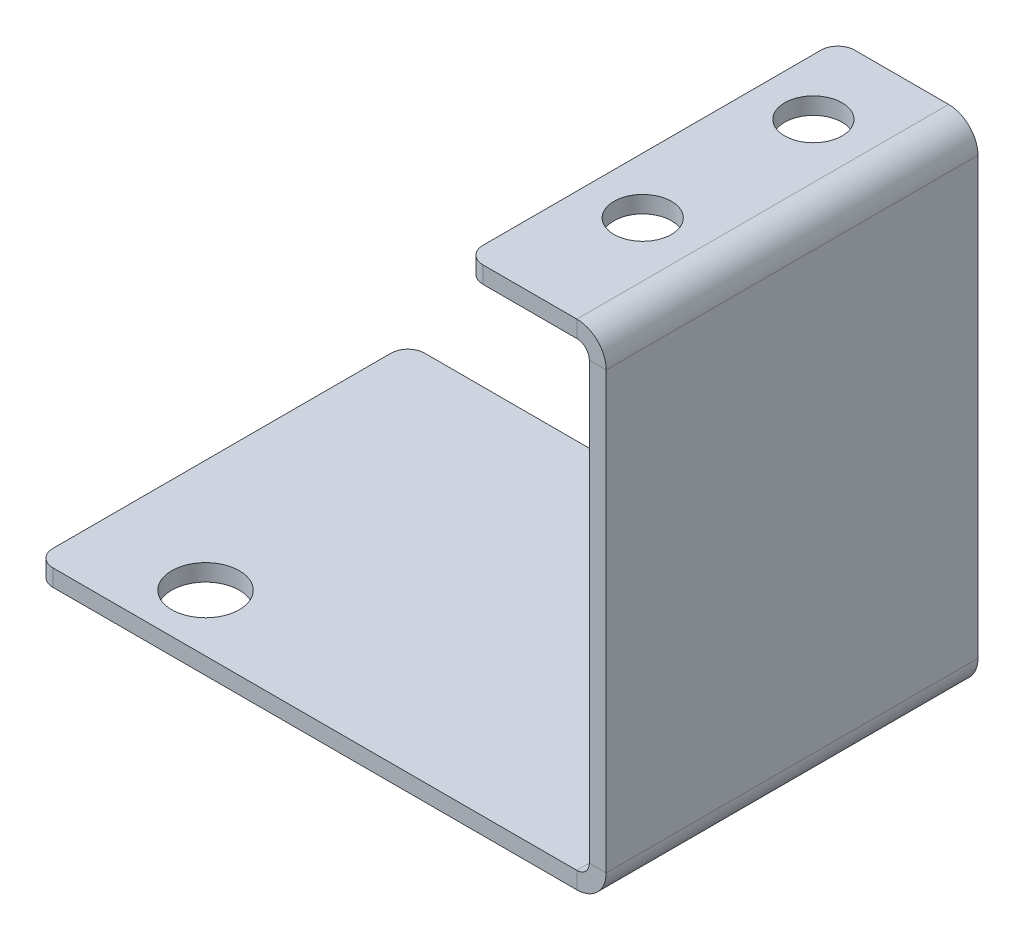
ISO-10303-21;
HEADER;
FILE_DESCRIPTION(('STEP AP214'),'2;1');
FILE_NAME('part.step','',(''),(''),'','','');
FILE_SCHEMA(('AUTOMOTIVE_DESIGN { 1 0 10303 214 1 1 1 1 }'));
ENDSEC;
DATA;
#1=APPLICATION_CONTEXT('core data for automotive mechanical design processes');
#2=APPLICATION_PROTOCOL_DEFINITION('international standard','automotive_design',2000,#1);
#3=PRODUCT_CONTEXT('',#1,'mechanical');
#4=PRODUCT('Part','Part','',(#3));
#5=PRODUCT_RELATED_PRODUCT_CATEGORY('part','',(#4));
#6=PRODUCT_DEFINITION_FORMATION('','',#4);
#7=PRODUCT_DEFINITION_CONTEXT('part definition',#1,'design');
#8=PRODUCT_DEFINITION('design','',#6,#7);
#9=PRODUCT_DEFINITION_SHAPE('','',#8);
#10=(LENGTH_UNIT() NAMED_UNIT(*) SI_UNIT(.MILLI.,.METRE.));
#11=(NAMED_UNIT(*) PLANE_ANGLE_UNIT() SI_UNIT($,.RADIAN.));
#12=(NAMED_UNIT(*) SI_UNIT($,.STERADIAN.) SOLID_ANGLE_UNIT());
#13=UNCERTAINTY_MEASURE_WITH_UNIT(LENGTH_MEASURE(1.E-05),#10,'distance_accuracy_value','');
#14=(GEOMETRIC_REPRESENTATION_CONTEXT(3) GLOBAL_UNCERTAINTY_ASSIGNED_CONTEXT((#13)) GLOBAL_UNIT_ASSIGNED_CONTEXT((#10,
#11,#12)) REPRESENTATION_CONTEXT('',''));
#15=CARTESIAN_POINT('',(0.,0.,0.));
#16=DIRECTION('',(0.,0.,1.));
#17=DIRECTION('',(1.,0.,0.));
#18=AXIS2_PLACEMENT_3D('',#15,#16,#17);
#19=CARTESIAN_POINT('',(-53.575192275457,54.1059455377422,0.));
#20=DIRECTION('',(1.,0.,0.));
#21=DIRECTION('',(0.,0.,-1.));
#22=AXIS2_PLACEMENT_3D('',#19,#20,#21);
#23=PLANE('',#22);
#24=DIRECTION('',(0.,-1.,0.));
#25=VECTOR('',#24,1.);
#26=CARTESIAN_POINT('',(-53.5751922754567,-33.2058467377146,-15.6679136445221));
#27=LINE('',#26,#25);
#28=CARTESIAN_POINT('',(-53.5751922754569,26.5141532622854,-15.6679136445221));
#29=VERTEX_POINT('',#28);
#30=CARTESIAN_POINT('',(-53.5751922754568,0.736600000000004,-15.6679136445221));
#31=VERTEX_POINT('',#30);
#32=EDGE_CURVE('E301',#29,#31,#27,.T.);
#33=ORIENTED_EDGE('',*,*,#32,.F.);
#34=DIRECTION('',(0.,0.,1.));
#35=VECTOR('',#34,1.);
#36=CARTESIAN_POINT('',(-53.5751922754569,26.5141532622854,0.));
#37=LINE('',#36,#35);
#38=CARTESIAN_POINT('',(-53.5751922754569,26.5141532622854,6.33208635547784));
#39=VERTEX_POINT('',#38);
#40=EDGE_CURVE('E309',#29,#39,#37,.T.);
#41=ORIENTED_EDGE('',*,*,#40,.T.);
#42=DIRECTION('',(0.,1.,0.));
#43=VECTOR('',#42,1.);
#44=CARTESIAN_POINT('',(-53.5751922754569,35.0141532622854,6.33208635547784));
#45=LINE('',#44,#43);
#46=CARTESIAN_POINT('',(-53.5751922754568,0.736600000000002,6.33208635547784));
#47=VERTEX_POINT('',#46);
#48=EDGE_CURVE('E316',#47,#39,#45,.T.);
#49=ORIENTED_EDGE('',*,*,#48,.F.);
#50=DIRECTION('',(0.,0.,1.));
#51=VECTOR('',#50,1.);
#52=CARTESIAN_POINT('',(-53.5751922754568,0.736600000000004,0.));
#53=LINE('',#52,#51);
#54=EDGE_CURVE('E297',#31,#47,#53,.T.);
#55=ORIENTED_EDGE('',*,*,#54,.F.);
#56=EDGE_LOOP('',(#33,#41,#49,#55));
#57=FACE_BOUND('',#56,.T.);
#58=ADVANCED_FACE('F51',(#57),#23,.T.);
#59=CARTESIAN_POINT('',(-53.5751922754569,35.0141532622854,6.33208635547784));
#60=DIRECTION('',(0.,0.,1.));
#61=DIRECTION('',(0.,1.,0.));
#62=AXIS2_PLACEMENT_3D('',#59,#60,#61);
#63=PLANE('',#62);
#64=ORIENTED_EDGE('',*,*,#48,.T.);
#65=DIRECTION('',(-1.,0.,0.));
#66=VECTOR('',#65,1.);
#67=CARTESIAN_POINT('',(-53.5751922754569,26.5141532622854,6.33208635547784));
#68=LINE('',#67,#66);
#69=CARTESIAN_POINT('',(-54.5751922754569,26.5141532622854,6.33208635547784));
#70=VERTEX_POINT('',#69);
#71=EDGE_CURVE('E12',#39,#70,#68,.T.);
#72=ORIENTED_EDGE('',*,*,#71,.T.);
#73=DIRECTION('',(0.,1.,0.));
#74=VECTOR('',#73,1.);
#75=CARTESIAN_POINT('',(-54.5751922754569,35.0141532622854,6.33208635547784));
#76=LINE('',#75,#74);
#77=CARTESIAN_POINT('',(-54.5751922754568,0.736599999999997,6.33208635547784));
#78=VERTEX_POINT('',#77);
#79=EDGE_CURVE('E254',#78,#70,#76,.T.);
#80=ORIENTED_EDGE('',*,*,#79,.F.);
#81=DIRECTION('',(-1.,0.,0.));
#82=VECTOR('',#81,1.);
#83=CARTESIAN_POINT('',(-53.5751922754568,0.736600000000004,6.33208635547784));
#84=LINE('',#83,#82);
#85=EDGE_CURVE('E300',#47,#78,#84,.T.);
#86=ORIENTED_EDGE('',*,*,#85,.F.);
#87=EDGE_LOOP('',(#64,#72,#80,#86));
#88=FACE_BOUND('',#87,.T.);
#89=ADVANCED_FACE('F53',(#88),#63,.T.);
#90=CARTESIAN_POINT('',(-53.5751922754567,-33.2058467377146,-15.6679136445221));
#91=DIRECTION('',(0.,0.,-1.));
#92=DIRECTION('',(0.,-1.,0.));
#93=AXIS2_PLACEMENT_3D('',#90,#91,#92);
#94=PLANE('',#93);
#95=DIRECTION('',(0.,-1.,0.));
#96=VECTOR('',#95,1.);
#97=CARTESIAN_POINT('',(-54.5751922754567,-33.2058467377146,-15.6679136445221));
#98=LINE('',#97,#96);
#99=CARTESIAN_POINT('',(-54.5751922754569,26.5141532622854,-15.6679136445221));
#100=VERTEX_POINT('',#99);
#101=CARTESIAN_POINT('',(-54.5751922754568,0.736599999999997,-15.6679136445221));
#102=VERTEX_POINT('',#101);
#103=EDGE_CURVE('E74',#100,#102,#98,.T.);
#104=ORIENTED_EDGE('',*,*,#103,.F.);
#105=DIRECTION('',(1.,0.,0.));
#106=VECTOR('',#105,1.);
#107=CARTESIAN_POINT('',(-53.5751922754569,26.5141532622854,-15.6679136445221));
#108=LINE('',#107,#106);
#109=EDGE_CURVE('E312',#100,#29,#108,.T.);
#110=ORIENTED_EDGE('',*,*,#109,.T.);
#111=ORIENTED_EDGE('',*,*,#32,.T.);
#112=DIRECTION('',(1.,0.,0.));
#113=VECTOR('',#112,1.);
#114=CARTESIAN_POINT('',(-53.5751922754568,0.736600000000004,-15.6679136445221));
#115=LINE('',#114,#113);
#116=EDGE_CURVE('E306',#102,#31,#115,.T.);
#117=ORIENTED_EDGE('',*,*,#116,.F.);
#118=EDGE_LOOP('',(#104,#110,#111,#117));
#119=FACE_BOUND('',#118,.T.);
#120=ADVANCED_FACE('F363',(#119),#94,.T.);
#121=CARTESIAN_POINT('',(-54.575192275457,54.1059455377422,0.));
#122=DIRECTION('',(1.,0.,0.));
#123=DIRECTION('',(0.,0.,-1.));
#124=AXIS2_PLACEMENT_3D('',#121,#122,#123);
#125=PLANE('',#124);
#126=DIRECTION('',(0.,0.,1.));
#127=VECTOR('',#126,1.);
#128=CARTESIAN_POINT('',(-54.5751922754569,26.5141532622854,0.));
#129=LINE('',#128,#127);
#130=EDGE_CURVE('E60',#100,#70,#129,.T.);
#131=ORIENTED_EDGE('',*,*,#130,.F.);
#132=ORIENTED_EDGE('',*,*,#103,.T.);
#133=DIRECTION('',(0.,0.,1.));
#134=VECTOR('',#133,1.);
#135=CARTESIAN_POINT('',(-54.5751922754568,0.736599999999997,0.));
#136=LINE('',#135,#134);
#137=EDGE_CURVE('E304',#102,#78,#136,.T.);
#138=ORIENTED_EDGE('',*,*,#137,.T.);
#139=ORIENTED_EDGE('',*,*,#79,.T.);
#140=EDGE_LOOP('',(#131,#132,#138,#139));
#141=FACE_BOUND('',#140,.T.);
#142=ADVANCED_FACE('F371',(#141),#125,.F.);
#143=CARTESIAN_POINT('',(-86.3117922754568,-1.,-14.6679136445221));
#144=DIRECTION('',(0.,1.,0.));
#145=DIRECTION('',(0.,0.,1.));
#146=AXIS2_PLACEMENT_3D('',#143,#144,#145);
#147=CYLINDRICAL_SURFACE('',#146,1.);
#148=CARTESIAN_POINT('',(-86.3117922754568,-1.,-14.6679136445221));
#149=DIRECTION('',(0.,-1.,0.));
#150=DIRECTION('',(0.,0.,-1.));
#151=AXIS2_PLACEMENT_3D('',#148,#149,#150);
#152=CIRCLE('',#151,1.);
#153=CARTESIAN_POINT('',(-87.3117922754568,-1.,-14.6679136445221));
#154=VERTEX_POINT('',#153);
#155=CARTESIAN_POINT('',(-86.3117922754568,-1.,-15.6679136445221));
#156=VERTEX_POINT('',#155);
#157=EDGE_CURVE('E280',#154,#156,#152,.T.);
#158=ORIENTED_EDGE('',*,*,#157,.F.);
#159=DIRECTION('',(0.,1.,0.));
#160=VECTOR('',#159,1.);
#161=CARTESIAN_POINT('',(-87.3117922754568,-1.,-14.6679136445221));
#162=LINE('',#161,#160);
#163=CARTESIAN_POINT('',(-87.3117922754568,0.,-14.6679136445221));
#164=VERTEX_POINT('',#163);
#165=EDGE_CURVE('E294',#164,#154,#162,.F.);
#166=ORIENTED_EDGE('',*,*,#165,.F.);
#167=CARTESIAN_POINT('',(-86.3117922754568,0.,-14.6679136445221));
#168=DIRECTION('',(0.,-1.,0.));
#169=DIRECTION('',(0.,0.,-1.));
#170=AXIS2_PLACEMENT_3D('',#167,#168,#169);
#171=CIRCLE('',#170,1.);
#172=CARTESIAN_POINT('',(-86.3117922754568,0.,-15.6679136445221));
#173=VERTEX_POINT('',#172);
#174=EDGE_CURVE('E268',#173,#164,#171,.F.);
#175=ORIENTED_EDGE('',*,*,#174,.F.);
#176=DIRECTION('',(0.,1.,0.));
#177=VECTOR('',#176,1.);
#178=CARTESIAN_POINT('',(-86.3117922754568,-1.,-15.6679136445221));
#179=LINE('',#178,#177);
#180=EDGE_CURVE('E251',#156,#173,#179,.T.);
#181=ORIENTED_EDGE('',*,*,#180,.F.);
#182=EDGE_LOOP('',(#158,#166,#175,#181));
#183=FACE_BOUND('',#182,.T.);
#184=ADVANCED_FACE('F374',(#183),#147,.T.);
#185=CARTESIAN_POINT('',(-87.3117922754568,-1.,6.33208635547785));
#186=DIRECTION('',(-1.,0.,0.));
#187=DIRECTION('',(0.,0.,1.));
#188=AXIS2_PLACEMENT_3D('',#185,#186,#187);
#189=PLANE('',#188);
#190=DIRECTION('',(0.,0.,1.));
#191=VECTOR('',#190,1.);
#192=CARTESIAN_POINT('',(-87.3117922754568,0.,6.33208635547785));
#193=LINE('',#192,#191);
#194=CARTESIAN_POINT('',(-87.3117922754568,0.,5.33208635547785));
#195=VERTEX_POINT('',#194);
#196=EDGE_CURVE('E265',#164,#195,#193,.T.);
#197=ORIENTED_EDGE('',*,*,#196,.F.);
#198=ORIENTED_EDGE('',*,*,#165,.T.);
#199=DIRECTION('',(0.,0.,1.));
#200=VECTOR('',#199,1.);
#201=CARTESIAN_POINT('',(-87.3117922754568,-1.,6.33208635547785));
#202=LINE('',#201,#200);
#203=CARTESIAN_POINT('',(-87.3117922754568,-1.,5.33208635547785));
#204=VERTEX_POINT('',#203);
#205=EDGE_CURVE('E291',#154,#204,#202,.T.);
#206=ORIENTED_EDGE('',*,*,#205,.T.);
#207=DIRECTION('',(0.,1.,0.));
#208=VECTOR('',#207,1.);
#209=CARTESIAN_POINT('',(-87.3117922754568,-1.,5.33208635547785));
#210=LINE('',#209,#208);
#211=EDGE_CURVE('E288',#204,#195,#210,.T.);
#212=ORIENTED_EDGE('',*,*,#211,.T.);
#213=EDGE_LOOP('',(#197,#198,#206,#212));
#214=FACE_BOUND('',#213,.T.);
#215=ADVANCED_FACE('F378',(#214),#189,.T.);
#216=CARTESIAN_POINT('',(-86.3117922754568,-1.,5.33208635547785));
#217=DIRECTION('',(0.,1.,0.));
#218=DIRECTION('',(0.,0.,1.));
#219=AXIS2_PLACEMENT_3D('',#216,#217,#218);
#220=CYLINDRICAL_SURFACE('',#219,1.);
#221=CARTESIAN_POINT('',(-86.3117922754568,-1.,5.33208635547785));
#222=DIRECTION('',(0.,-1.,0.));
#223=DIRECTION('',(0.,0.,-1.));
#224=AXIS2_PLACEMENT_3D('',#221,#222,#223);
#225=CIRCLE('',#224,1.);
#226=CARTESIAN_POINT('',(-86.3117922754568,-1.,6.33208635547785));
#227=VERTEX_POINT('',#226);
#228=EDGE_CURVE('E283',#227,#204,#225,.T.);
#229=ORIENTED_EDGE('',*,*,#228,.F.);
#230=DIRECTION('',(0.,1.,0.));
#231=VECTOR('',#230,1.);
#232=CARTESIAN_POINT('',(-86.3117922754568,-1.,6.33208635547785));
#233=LINE('',#232,#231);
#234=CARTESIAN_POINT('',(-86.3117922754568,0.,6.33208635547785));
#235=VERTEX_POINT('',#234);
#236=EDGE_CURVE('E272',#235,#227,#233,.F.);
#237=ORIENTED_EDGE('',*,*,#236,.F.);
#238=CARTESIAN_POINT('',(-86.3117922754568,0.,5.33208635547785));
#239=DIRECTION('',(0.,-1.,0.));
#240=DIRECTION('',(0.,0.,-1.));
#241=AXIS2_PLACEMENT_3D('',#238,#239,#240);
#242=CIRCLE('',#241,1.);
#243=EDGE_CURVE('E263',#195,#235,#242,.F.);
#244=ORIENTED_EDGE('',*,*,#243,.F.);
#245=ORIENTED_EDGE('',*,*,#211,.F.);
#246=EDGE_LOOP('',(#229,#237,#244,#245));
#247=FACE_BOUND('',#246,.T.);
#248=ADVANCED_FACE('F456',(#247),#220,.T.);
#249=CARTESIAN_POINT('',(0.,-1.,0.));
#250=DIRECTION('',(0.,-1.,0.));
#251=DIRECTION('',(0.,0.,-1.));
#252=AXIS2_PLACEMENT_3D('',#249,#250,#251);
#253=PLANE('',#252);
#254=CARTESIAN_POINT('',(-80.6546086310978,-1.,2.96173769320667));
#255=DIRECTION('',(0.,-1.,0.));
#256=DIRECTION('',(0.,0.,-1.));
#257=AXIS2_PLACEMENT_3D('',#254,#255,#256);
#258=CIRCLE('',#257,2.);
#259=CARTESIAN_POINT('',(-80.6546086310978,-1.,0.961737693206676));
#260=VERTEX_POINT('',#259);
#261=EDGE_CURVE('E199',#260,#260,#258,.T.);
#262=ORIENTED_EDGE('',*,*,#261,.F.);
#263=EDGE_LOOP('',(#262));
#264=FACE_BOUND('',#263,.T.);
#265=DIRECTION('',(-1.,0.,0.));
#266=VECTOR('',#265,1.);
#267=CARTESIAN_POINT('',(-87.3117922754568,-1.,-15.6679136445221));
#268=LINE('',#267,#266);
#269=CARTESIAN_POINT('',(-55.3117922754568,-0.999999999999999,-15.6679136445221));
#270=VERTEX_POINT('',#269);
#271=EDGE_CURVE('E255',#270,#156,#268,.T.);
#272=ORIENTED_EDGE('',*,*,#271,.F.);
#273=DIRECTION('',(0.,0.,1.));
#274=VECTOR('',#273,1.);
#275=CARTESIAN_POINT('',(-55.3117922754568,-1.,0.));
#276=LINE('',#275,#274);
#277=CARTESIAN_POINT('',(-55.3117922754568,-0.999999999999999,6.33208635547784));
#278=VERTEX_POINT('',#277);
#279=EDGE_CURVE('E285',#270,#278,#276,.T.);
#280=ORIENTED_EDGE('',*,*,#279,.T.);
#281=DIRECTION('',(1.,0.,0.));
#282=VECTOR('',#281,1.);
#283=CARTESIAN_POINT('',(-19.0917922754568,-1.,6.33208635547784));
#284=LINE('',#283,#282);
#285=EDGE_CURVE('E277',#227,#278,#284,.T.);
#286=ORIENTED_EDGE('',*,*,#285,.F.);
#287=ORIENTED_EDGE('',*,*,#228,.T.);
#288=ORIENTED_EDGE('',*,*,#205,.F.);
#289=ORIENTED_EDGE('',*,*,#157,.T.);
#290=EDGE_LOOP('',(#272,#280,#286,#287,#288,#289));
#291=FACE_BOUND('',#290,.T.);
#292=ADVANCED_FACE('F460',(#264,#291),#253,.T.);
#293=CARTESIAN_POINT('',(-19.0917922754568,-1.,6.33208635547784));
#294=DIRECTION('',(0.,0.,1.));
#295=DIRECTION('',(1.,0.,0.));
#296=AXIS2_PLACEMENT_3D('',#293,#294,#295);
#297=PLANE('',#296);
#298=ORIENTED_EDGE('',*,*,#285,.T.);
#299=DIRECTION('',(0.,1.,0.));
#300=VECTOR('',#299,1.);
#301=CARTESIAN_POINT('',(-55.3117922754568,-1.,6.33208635547784));
#302=LINE('',#301,#300);
#303=CARTESIAN_POINT('',(-55.3117922754568,0.,6.33208635547784));
#304=VERTEX_POINT('',#303);
#305=EDGE_CURVE('E274',#278,#304,#302,.T.);
#306=ORIENTED_EDGE('',*,*,#305,.T.);
#307=DIRECTION('',(1.,0.,0.));
#308=VECTOR('',#307,1.);
#309=CARTESIAN_POINT('',(-19.0917922754568,0.,6.33208635547784));
#310=LINE('',#309,#308);
#311=EDGE_CURVE('E260',#235,#304,#310,.T.);
#312=ORIENTED_EDGE('',*,*,#311,.F.);
#313=ORIENTED_EDGE('',*,*,#236,.T.);
#314=EDGE_LOOP('',(#298,#306,#312,#313));
#315=FACE_BOUND('',#314,.T.);
#316=ADVANCED_FACE('F464',(#315),#297,.T.);
#317=CARTESIAN_POINT('',(0.,0.,0.));
#318=DIRECTION('',(0.,-1.,0.));
#319=DIRECTION('',(0.,0.,-1.));
#320=AXIS2_PLACEMENT_3D('',#317,#318,#319);
#321=PLANE('',#320);
#322=CARTESIAN_POINT('',(-80.6546086310978,0.,2.96173769320667));
#323=DIRECTION('',(0.,-1.,0.));
#324=DIRECTION('',(0.,0.,-1.));
#325=AXIS2_PLACEMENT_3D('',#322,#323,#324);
#326=CIRCLE('',#325,2.);
#327=CARTESIAN_POINT('',(-80.6546086310978,0.,0.961737693206676));
#328=VERTEX_POINT('',#327);
#329=EDGE_CURVE('E323',#328,#328,#326,.T.);
#330=ORIENTED_EDGE('',*,*,#329,.T.);
#331=EDGE_LOOP('',(#330));
#332=FACE_BOUND('',#331,.T.);
#333=DIRECTION('',(0.,0.,1.));
#334=VECTOR('',#333,1.);
#335=CARTESIAN_POINT('',(-55.3117922754568,0.,0.));
#336=LINE('',#335,#334);
#337=CARTESIAN_POINT('',(-55.3117922754568,0.,-15.6679136445221));
#338=VERTEX_POINT('',#337);
#339=EDGE_CURVE('E246',#338,#304,#336,.T.);
#340=ORIENTED_EDGE('',*,*,#339,.F.);
#341=DIRECTION('',(-1.,0.,0.));
#342=VECTOR('',#341,1.);
#343=CARTESIAN_POINT('',(-87.3117922754568,0.,-15.6679136445221));
#344=LINE('',#343,#342);
#345=EDGE_CURVE('E270',#338,#173,#344,.T.);
#346=ORIENTED_EDGE('',*,*,#345,.T.);
#347=ORIENTED_EDGE('',*,*,#174,.T.);
#348=ORIENTED_EDGE('',*,*,#196,.T.);
#349=ORIENTED_EDGE('',*,*,#243,.T.);
#350=ORIENTED_EDGE('',*,*,#311,.T.);
#351=EDGE_LOOP('',(#340,#346,#347,#348,#349,#350));
#352=FACE_BOUND('',#351,.T.);
#353=ADVANCED_FACE('F467',(#332,#352),#321,.F.);
#354=CARTESIAN_POINT('',(-87.3117922754568,-1.,-15.6679136445221));
#355=DIRECTION('',(0.,0.,-1.));
#356=DIRECTION('',(-1.,0.,0.));
#357=AXIS2_PLACEMENT_3D('',#354,#355,#356);
#358=PLANE('',#357);
#359=ORIENTED_EDGE('',*,*,#345,.F.);
#360=DIRECTION('',(0.,-1.,0.));
#361=VECTOR('',#360,1.);
#362=CARTESIAN_POINT('',(-55.3117922754568,-1.,-15.6679136445221));
#363=LINE('',#362,#361);
#364=EDGE_CURVE('E257',#338,#270,#363,.T.);
#365=ORIENTED_EDGE('',*,*,#364,.T.);
#366=ORIENTED_EDGE('',*,*,#271,.T.);
#367=ORIENTED_EDGE('',*,*,#180,.T.);
#368=EDGE_LOOP('',(#359,#365,#366,#367));
#369=FACE_BOUND('',#368,.T.);
#370=ADVANCED_FACE('F368',(#369),#358,.T.);
#371=CARTESIAN_POINT('',(-55.3117922754568,0.7366,-15.6679136445221));
#372=DIRECTION('',(0.,0.,-1.));
#373=DIRECTION('',(-1.,0.,0.));
#374=AXIS2_PLACEMENT_3D('',#371,#372,#373);
#375=PLANE('',#374);
#376=ORIENTED_EDGE('',*,*,#364,.F.);
#377=CARTESIAN_POINT('',(-55.3117922754568,0.7366,-15.6679136445221));
#378=DIRECTION('',(0.,0.,1.));
#379=DIRECTION('',(1.,0.,0.));
#380=AXIS2_PLACEMENT_3D('',#377,#378,#379);
#381=CIRCLE('',#380,0.7366);
#382=EDGE_CURVE('E237',#338,#102,#381,.T.);
#383=ORIENTED_EDGE('',*,*,#382,.T.);
#384=ORIENTED_EDGE('',*,*,#116,.T.);
#385=CARTESIAN_POINT('',(-55.3117922754568,0.7366,-15.6679136445221));
#386=DIRECTION('',(0.,0.,1.));
#387=DIRECTION('',(-1.,0.,0.));
#388=AXIS2_PLACEMENT_3D('',#385,#386,#387);
#389=CIRCLE('',#388,1.7366);
#390=EDGE_CURVE('E239',#270,#31,#389,.T.);
#391=ORIENTED_EDGE('',*,*,#390,.F.);
#392=EDGE_LOOP('',(#376,#383,#384,#391));
#393=FACE_BOUND('',#392,.T.);
#394=ADVANCED_FACE('F449',(#393),#375,.T.);
#395=CARTESIAN_POINT('',(-55.3117922754568,0.7366,6.33208635547784));
#396=DIRECTION('',(0.,0.,1.));
#397=DIRECTION('',(1.,0.,0.));
#398=AXIS2_PLACEMENT_3D('',#395,#396,#397);
#399=PLANE('',#398);
#400=ORIENTED_EDGE('',*,*,#85,.T.);
#401=CARTESIAN_POINT('',(-55.3117922754568,0.7366,6.33208635547784));
#402=DIRECTION('',(0.,0.,1.));
#403=DIRECTION('',(1.,0.,0.));
#404=AXIS2_PLACEMENT_3D('',#401,#402,#403);
#405=CIRCLE('',#404,0.7366);
#406=EDGE_CURVE('E243',#78,#304,#405,.F.);
#407=ORIENTED_EDGE('',*,*,#406,.T.);
#408=ORIENTED_EDGE('',*,*,#305,.F.);
#409=CARTESIAN_POINT('',(-55.3117922754568,0.7366,6.33208635547784));
#410=DIRECTION('',(0.,0.,-1.));
#411=DIRECTION('',(1.,0.,0.));
#412=AXIS2_PLACEMENT_3D('',#409,#410,#411);
#413=CIRCLE('',#412,1.7366);
#414=EDGE_CURVE('E242',#47,#278,#413,.T.);
#415=ORIENTED_EDGE('',*,*,#414,.F.);
#416=EDGE_LOOP('',(#400,#407,#408,#415));
#417=FACE_BOUND('',#416,.T.);
#418=ADVANCED_FACE('F442',(#417),#399,.T.);
#419=CARTESIAN_POINT('',(-55.3117922754568,0.7366,-26.7761270352251));
#420=DIRECTION('',(0.,0.,1.));
#421=DIRECTION('',(1.,0.,0.));
#422=AXIS2_PLACEMENT_3D('',#419,#420,#421);
#423=CYLINDRICAL_SURFACE('',#422,1.7366);
#424=ORIENTED_EDGE('',*,*,#414,.T.);
#425=ORIENTED_EDGE('',*,*,#279,.F.);
#426=ORIENTED_EDGE('',*,*,#390,.T.);
#427=ORIENTED_EDGE('',*,*,#54,.T.);
#428=EDGE_LOOP('',(#424,#425,#426,#427));
#429=FACE_BOUND('',#428,.T.);
#430=ADVANCED_FACE('F439',(#429),#423,.T.);
#431=CARTESIAN_POINT('',(-55.3117922754568,0.7366,-26.7761270352251));
#432=DIRECTION('',(0.,0.,1.));
#433=DIRECTION('',(1.,0.,0.));
#434=AXIS2_PLACEMENT_3D('',#431,#432,#433);
#435=CYLINDRICAL_SURFACE('',#434,0.7366);
#436=ORIENTED_EDGE('',*,*,#406,.F.);
#437=ORIENTED_EDGE('',*,*,#137,.F.);
#438=ORIENTED_EDGE('',*,*,#382,.F.);
#439=ORIENTED_EDGE('',*,*,#339,.T.);
#440=EDGE_LOOP('',(#436,#437,#438,#439));
#441=FACE_BOUND('',#440,.T.);
#442=ADVANCED_FACE('F438',(#441),#435,.F.);
#443=CARTESIAN_POINT('',(-55.3117922754569,26.5141532622854,-15.6679136445221));
#444=DIRECTION('',(0.,0.,-1.));
#445=DIRECTION('',(-1.,0.,0.));
#446=AXIS2_PLACEMENT_3D('',#443,#444,#445);
#447=PLANE('',#446);
#448=ORIENTED_EDGE('',*,*,#109,.F.);
#449=CARTESIAN_POINT('',(-55.3117922754569,26.5141532622854,-15.6679136445221));
#450=DIRECTION('',(0.,0.,1.));
#451=DIRECTION('',(0.,-1.,0.));
#452=AXIS2_PLACEMENT_3D('',#449,#450,#451);
#453=CIRCLE('',#452,0.7366);
#454=CARTESIAN_POINT('',(-55.3117922754569,27.2507532622854,-15.6679136445221));
#455=VERTEX_POINT('',#454);
#456=EDGE_CURVE('E193',#100,#455,#453,.T.);
#457=ORIENTED_EDGE('',*,*,#456,.T.);
#458=DIRECTION('',(0.,1.,0.));
#459=VECTOR('',#458,1.);
#460=CARTESIAN_POINT('',(-55.3117922754569,28.2507532622854,-15.6679136445221));
#461=LINE('',#460,#459);
#462=CARTESIAN_POINT('',(-55.3117922754569,28.2507532622854,-15.6679136445221));
#463=VERTEX_POINT('',#462);
#464=EDGE_CURVE('E225',#455,#463,#461,.T.);
#465=ORIENTED_EDGE('',*,*,#464,.T.);
#466=CARTESIAN_POINT('',(-55.3117922754569,26.5141532622854,-15.6679136445221));
#467=DIRECTION('',(0.,0.,1.));
#468=DIRECTION('',(-1.,0.,0.));
#469=AXIS2_PLACEMENT_3D('',#466,#467,#468);
#470=CIRCLE('',#469,1.7366);
#471=EDGE_CURVE('E231',#29,#463,#470,.T.);
#472=ORIENTED_EDGE('',*,*,#471,.F.);
#473=EDGE_LOOP('',(#448,#457,#465,#472));
#474=FACE_BOUND('',#473,.T.);
#475=ADVANCED_FACE('F391',(#474),#447,.T.);
#476=CARTESIAN_POINT('',(-55.3117922754569,26.5141532622854,6.33208635547784));
#477=DIRECTION('',(0.,0.,1.));
#478=DIRECTION('',(1.,0.,0.));
#479=AXIS2_PLACEMENT_3D('',#476,#477,#478);
#480=PLANE('',#479);
#481=DIRECTION('',(0.,-1.,0.));
#482=VECTOR('',#481,1.);
#483=CARTESIAN_POINT('',(-55.3117922754569,28.2507532622854,6.33208635547784));
#484=LINE('',#483,#482);
#485=CARTESIAN_POINT('',(-55.3117922754569,28.2507532622854,6.33208635547784));
#486=VERTEX_POINT('',#485);
#487=CARTESIAN_POINT('',(-55.3117922754569,27.2507532622854,6.33208635547784));
#488=VERTEX_POINT('',#487);
#489=EDGE_CURVE('E174',#486,#488,#484,.T.);
#490=ORIENTED_EDGE('',*,*,#489,.T.);
#491=CARTESIAN_POINT('',(-55.3117922754569,26.5141532622854,6.33208635547784));
#492=DIRECTION('',(0.,0.,1.));
#493=DIRECTION('',(0.,-1.,0.));
#494=AXIS2_PLACEMENT_3D('',#491,#492,#493);
#495=CIRCLE('',#494,0.7366);
#496=EDGE_CURVE('E196',#488,#70,#495,.F.);
#497=ORIENTED_EDGE('',*,*,#496,.T.);
#498=ORIENTED_EDGE('',*,*,#71,.F.);
#499=CARTESIAN_POINT('',(-55.3117922754569,26.5141532622854,6.33208635547784));
#500=DIRECTION('',(0.,0.,-1.));
#501=DIRECTION('',(1.,0.,0.));
#502=AXIS2_PLACEMENT_3D('',#499,#500,#501);
#503=CIRCLE('',#502,1.7366);
#504=EDGE_CURVE('E234',#486,#39,#503,.T.);
#505=ORIENTED_EDGE('',*,*,#504,.F.);
#506=EDGE_LOOP('',(#490,#497,#498,#505));
#507=FACE_BOUND('',#506,.T.);
#508=ADVANCED_FACE('F385',(#507),#480,.T.);
#509=CARTESIAN_POINT('',(-55.3117922754569,26.5141532622854,-26.7761270352251));
#510=DIRECTION('',(0.,0.,1.));
#511=DIRECTION('',(0.,-1.,0.));
#512=AXIS2_PLACEMENT_3D('',#509,#510,#511);
#513=CYLINDRICAL_SURFACE('',#512,1.7366);
#514=ORIENTED_EDGE('',*,*,#504,.T.);
#515=ORIENTED_EDGE('',*,*,#40,.F.);
#516=ORIENTED_EDGE('',*,*,#471,.T.);
#517=DIRECTION('',(0.,0.,1.));
#518=VECTOR('',#517,1.);
#519=CARTESIAN_POINT('',(-55.3117922754569,28.2507532622854,0.));
#520=LINE('',#519,#518);
#521=EDGE_CURVE('E229',#463,#486,#520,.T.);
#522=ORIENTED_EDGE('',*,*,#521,.T.);
#523=EDGE_LOOP('',(#514,#515,#516,#522));
#524=FACE_BOUND('',#523,.T.);
#525=ADVANCED_FACE('F388',(#524),#513,.T.);
#526=CARTESIAN_POINT('',(-55.3117922754569,26.5141532622854,-26.7761270352251));
#527=DIRECTION('',(0.,0.,1.));
#528=DIRECTION('',(0.,-1.,0.));
#529=AXIS2_PLACEMENT_3D('',#526,#527,#528);
#530=CYLINDRICAL_SURFACE('',#529,0.7366);
#531=ORIENTED_EDGE('',*,*,#496,.F.);
#532=DIRECTION('',(0.,0.,1.));
#533=VECTOR('',#532,1.);
#534=CARTESIAN_POINT('',(-55.3117922754569,27.2507532622854,0.));
#535=LINE('',#534,#533);
#536=EDGE_CURVE('E209',#455,#488,#535,.T.);
#537=ORIENTED_EDGE('',*,*,#536,.F.);
#538=ORIENTED_EDGE('',*,*,#456,.F.);
#539=ORIENTED_EDGE('',*,*,#130,.T.);
#540=EDGE_LOOP('',(#531,#537,#538,#539));
#541=FACE_BOUND('',#540,.T.);
#542=ADVANCED_FACE('F393',(#541),#530,.F.);
#543=CARTESIAN_POINT('',(-60.8693455377423,28.2507532622854,5.33208635547784));
#544=DIRECTION('',(0.,-1.,0.));
#545=DIRECTION('',(0.,0.,1.));
#546=AXIS2_PLACEMENT_3D('',#543,#544,#545);
#547=CYLINDRICAL_SURFACE('',#546,1.);
#548=CARTESIAN_POINT('',(-60.8693455377423,28.2507532622854,5.33208635547784));
#549=DIRECTION('',(0.,1.,0.));
#550=DIRECTION('',(0.,0.,-1.));
#551=AXIS2_PLACEMENT_3D('',#548,#549,#550);
#552=CIRCLE('',#551,1.);
#553=CARTESIAN_POINT('',(-61.8693455377423,28.2507532622854,5.33208635547784));
#554=VERTEX_POINT('',#553);
#555=CARTESIAN_POINT('',(-60.8693455377423,28.2507532622854,6.33208635547784));
#556=VERTEX_POINT('',#555);
#557=EDGE_CURVE('E181',#554,#556,#552,.T.);
#558=ORIENTED_EDGE('',*,*,#557,.F.);
#559=DIRECTION('',(0.,-1.,0.));
#560=VECTOR('',#559,1.);
#561=CARTESIAN_POINT('',(-61.8693455377423,28.2507532622854,5.33208635547784));
#562=LINE('',#561,#560);
#563=CARTESIAN_POINT('',(-61.8693455377423,27.2507532622854,5.33208635547784));
#564=VERTEX_POINT('',#563);
#565=EDGE_CURVE('E223',#564,#554,#562,.F.);
#566=ORIENTED_EDGE('',*,*,#565,.F.);
#567=CARTESIAN_POINT('',(-60.8693455377423,27.2507532622854,5.33208635547784));
#568=DIRECTION('',(0.,1.,0.));
#569=DIRECTION('',(0.,0.,-1.));
#570=AXIS2_PLACEMENT_3D('',#567,#568,#569);
#571=CIRCLE('',#570,1.);
#572=CARTESIAN_POINT('',(-60.8693455377423,27.2507532622854,6.33208635547784));
#573=VERTEX_POINT('',#572);
#574=EDGE_CURVE('E192',#573,#564,#571,.F.);
#575=ORIENTED_EDGE('',*,*,#574,.F.);
#576=DIRECTION('',(0.,-1.,0.));
#577=VECTOR('',#576,1.);
#578=CARTESIAN_POINT('',(-60.8693455377423,28.2507532622854,6.33208635547784));
#579=LINE('',#578,#577);
#580=EDGE_CURVE('E172',#556,#573,#579,.T.);
#581=ORIENTED_EDGE('',*,*,#580,.F.);
#582=EDGE_LOOP('',(#558,#566,#575,#581));
#583=FACE_BOUND('',#582,.T.);
#584=ADVANCED_FACE('F191',(#583),#547,.T.);
#585=CARTESIAN_POINT('',(-61.8693455377423,28.2507532622854,-15.6679136445221));
#586=DIRECTION('',(-1.,0.,0.));
#587=DIRECTION('',(0.,0.,-1.));
#588=AXIS2_PLACEMENT_3D('',#585,#586,#587);
#589=PLANE('',#588);
#590=DIRECTION('',(0.,0.,-1.));
#591=VECTOR('',#590,1.);
#592=CARTESIAN_POINT('',(-61.8693455377423,27.2507532622854,-15.6679136445221));
#593=LINE('',#592,#591);
#594=CARTESIAN_POINT('',(-61.8693455377423,27.2507532622854,-14.6679136445221));
#595=VERTEX_POINT('',#594);
#596=EDGE_CURVE('E203',#564,#595,#593,.T.);
#597=ORIENTED_EDGE('',*,*,#596,.F.);
#598=ORIENTED_EDGE('',*,*,#565,.T.);
#599=DIRECTION('',(0.,0.,-1.));
#600=VECTOR('',#599,1.);
#601=CARTESIAN_POINT('',(-61.8693455377423,28.2507532622854,-15.6679136445221));
#602=LINE('',#601,#600);
#603=CARTESIAN_POINT('',(-61.8693455377423,28.2507532622854,-14.6679136445221));
#604=VERTEX_POINT('',#603);
#605=EDGE_CURVE('E184',#554,#604,#602,.T.);
#606=ORIENTED_EDGE('',*,*,#605,.T.);
#607=DIRECTION('',(0.,-1.,0.));
#608=VECTOR('',#607,1.);
#609=CARTESIAN_POINT('',(-61.8693455377423,28.2507532622854,-14.6679136445221));
#610=LINE('',#609,#608);
#611=EDGE_CURVE('E219',#604,#595,#610,.T.);
#612=ORIENTED_EDGE('',*,*,#611,.T.);
#613=EDGE_LOOP('',(#597,#598,#606,#612));
#614=FACE_BOUND('',#613,.T.);
#615=ADVANCED_FACE('F354',(#614),#589,.T.);
#616=CARTESIAN_POINT('',(-60.8693455377423,28.2507532622854,-14.6679136445221));
#617=DIRECTION('',(0.,-1.,0.));
#618=DIRECTION('',(0.,0.,1.));
#619=AXIS2_PLACEMENT_3D('',#616,#617,#618);
#620=CYLINDRICAL_SURFACE('',#619,1.);
#621=CARTESIAN_POINT('',(-60.8693455377423,28.2507532622854,-14.6679136445221));
#622=DIRECTION('',(0.,1.,0.));
#623=DIRECTION('',(0.,0.,-1.));
#624=AXIS2_PLACEMENT_3D('',#621,#622,#623);
#625=CIRCLE('',#624,1.);
#626=CARTESIAN_POINT('',(-60.8693455377423,28.2507532622854,-15.6679136445221));
#627=VERTEX_POINT('',#626);
#628=EDGE_CURVE('E188',#627,#604,#625,.T.);
#629=ORIENTED_EDGE('',*,*,#628,.F.);
#630=DIRECTION('',(0.,-1.,0.));
#631=VECTOR('',#630,1.);
#632=CARTESIAN_POINT('',(-60.8693455377423,28.2507532622854,-15.6679136445221));
#633=LINE('',#632,#631);
#634=CARTESIAN_POINT('',(-60.8693455377423,27.2507532622854,-15.6679136445221));
#635=VERTEX_POINT('',#634);
#636=EDGE_CURVE('E187',#635,#627,#633,.F.);
#637=ORIENTED_EDGE('',*,*,#636,.F.);
#638=CARTESIAN_POINT('',(-60.8693455377423,27.2507532622854,-14.6679136445221));
#639=DIRECTION('',(0.,1.,0.));
#640=DIRECTION('',(0.,0.,-1.));
#641=AXIS2_PLACEMENT_3D('',#638,#639,#640);
#642=CIRCLE('',#641,1.);
#643=EDGE_CURVE('E177',#595,#635,#642,.F.);
#644=ORIENTED_EDGE('',*,*,#643,.F.);
#645=ORIENTED_EDGE('',*,*,#611,.F.);
#646=EDGE_LOOP('',(#629,#637,#644,#645));
#647=FACE_BOUND('',#646,.T.);
#648=ADVANCED_FACE('F344',(#647),#620,.T.);
#649=CARTESIAN_POINT('',(-80.9611378131991,28.2507532622852,0.));
#650=DIRECTION('',(0.,1.,0.));
#651=DIRECTION('',(0.,0.,-1.));
#652=AXIS2_PLACEMENT_3D('',#649,#650,#651);
#653=PLANE('',#652);
#654=CARTESIAN_POINT('',(-58.548227621098,28.2507532622854,-10.9016631367933));
#655=DIRECTION('',(0.,1.,0.));
#656=DIRECTION('',(-1.,0.,0.));
#657=AXIS2_PLACEMENT_3D('',#654,#655,#656);
#658=CIRCLE('',#657,1.7);
#659=CARTESIAN_POINT('',(-60.248227621098,28.2507532622854,-10.9016631367933));
#660=VERTEX_POINT('',#659);
#661=EDGE_CURVE('E327',#660,#660,#658,.T.);
#662=ORIENTED_EDGE('',*,*,#661,.F.);
#663=EDGE_LOOP('',(#662));
#664=FACE_BOUND('',#663,.T.);
#665=CARTESIAN_POINT('',(-58.548227621098,28.2507532622854,-0.801663136793335));
#666=DIRECTION('',(0.,1.,0.));
#667=DIRECTION('',(-1.,0.,0.));
#668=AXIS2_PLACEMENT_3D('',#665,#666,#667);
#669=CIRCLE('',#668,1.7);
#670=CARTESIAN_POINT('',(-60.248227621098,28.2507532622854,-0.801663136793335));
#671=VERTEX_POINT('',#670);
#672=EDGE_CURVE('E332',#671,#671,#669,.T.);
#673=ORIENTED_EDGE('',*,*,#672,.F.);
#674=EDGE_LOOP('',(#673));
#675=FACE_BOUND('',#674,.T.);
#676=ORIENTED_EDGE('',*,*,#521,.F.);
#677=DIRECTION('',(1.,0.,0.));
#678=VECTOR('',#677,1.);
#679=CARTESIAN_POINT('',(6.35065446225771,28.2507532622859,-15.6679136445222));
#680=LINE('',#679,#678);
#681=EDGE_CURVE('E214',#627,#463,#680,.T.);
#682=ORIENTED_EDGE('',*,*,#681,.F.);
#683=ORIENTED_EDGE('',*,*,#628,.T.);
#684=ORIENTED_EDGE('',*,*,#605,.F.);
#685=ORIENTED_EDGE('',*,*,#557,.T.);
#686=DIRECTION('',(-1.,0.,0.));
#687=VECTOR('',#686,1.);
#688=CARTESIAN_POINT('',(-61.8693455377423,28.2507532622854,6.33208635547784));
#689=LINE('',#688,#687);
#690=EDGE_CURVE('E168',#486,#556,#689,.T.);
#691=ORIENTED_EDGE('',*,*,#690,.F.);
#692=EDGE_LOOP('',(#676,#682,#683,#684,#685,#691));
#693=FACE_BOUND('',#692,.T.);
#694=ADVANCED_FACE('F182',(#664,#675,#693),#653,.T.);
#695=CARTESIAN_POINT('',(6.35065446225771,28.2507532622859,-15.6679136445222));
#696=DIRECTION('',(0.,0.,-1.));
#697=DIRECTION('',(1.,0.,0.));
#698=AXIS2_PLACEMENT_3D('',#695,#696,#697);
#699=PLANE('',#698);
#700=ORIENTED_EDGE('',*,*,#464,.F.);
#701=DIRECTION('',(1.,0.,0.));
#702=VECTOR('',#701,1.);
#703=CARTESIAN_POINT('',(6.35065446225771,27.2507532622859,-15.6679136445222));
#704=LINE('',#703,#702);
#705=EDGE_CURVE('E212',#635,#455,#704,.T.);
#706=ORIENTED_EDGE('',*,*,#705,.F.);
#707=ORIENTED_EDGE('',*,*,#636,.T.);
#708=ORIENTED_EDGE('',*,*,#681,.T.);
#709=EDGE_LOOP('',(#700,#706,#707,#708));
#710=FACE_BOUND('',#709,.T.);
#711=ADVANCED_FACE('F343',(#710),#699,.T.);
#712=CARTESIAN_POINT('',(-80.9611378131991,27.2507532622852,0.));
#713=DIRECTION('',(0.,1.,0.));
#714=DIRECTION('',(0.,0.,-1.));
#715=AXIS2_PLACEMENT_3D('',#712,#713,#714);
#716=PLANE('',#715);
#717=CARTESIAN_POINT('',(-58.548227621098,27.2507532622854,-10.9016631367933));
#718=DIRECTION('',(0.,1.,0.));
#719=DIRECTION('',(-1.,0.,0.));
#720=AXIS2_PLACEMENT_3D('',#717,#718,#719);
#721=CIRCLE('',#720,1.7);
#722=CARTESIAN_POINT('',(-60.248227621098,27.2507532622854,-10.9016631367933));
#723=VERTEX_POINT('',#722);
#724=EDGE_CURVE('E55',#723,#723,#721,.T.);
#725=ORIENTED_EDGE('',*,*,#724,.T.);
#726=EDGE_LOOP('',(#725));
#727=FACE_BOUND('',#726,.T.);
#728=CARTESIAN_POINT('',(-58.548227621098,27.2507532622854,-0.801663136793335));
#729=DIRECTION('',(0.,1.,0.));
#730=DIRECTION('',(-1.,0.,0.));
#731=AXIS2_PLACEMENT_3D('',#728,#729,#730);
#732=CIRCLE('',#731,1.7);
#733=CARTESIAN_POINT('',(-60.248227621098,27.2507532622854,-0.801663136793335));
#734=VERTEX_POINT('',#733);
#735=EDGE_CURVE('E325',#734,#734,#732,.T.);
#736=ORIENTED_EDGE('',*,*,#735,.T.);
#737=EDGE_LOOP('',(#736));
#738=FACE_BOUND('',#737,.T.);
#739=ORIENTED_EDGE('',*,*,#705,.T.);
#740=ORIENTED_EDGE('',*,*,#536,.T.);
#741=DIRECTION('',(-1.,0.,0.));
#742=VECTOR('',#741,1.);
#743=CARTESIAN_POINT('',(-61.8693455377423,27.2507532622854,6.33208635547784));
#744=LINE('',#743,#742);
#745=EDGE_CURVE('E207',#488,#573,#744,.T.);
#746=ORIENTED_EDGE('',*,*,#745,.T.);
#747=ORIENTED_EDGE('',*,*,#574,.T.);
#748=ORIENTED_EDGE('',*,*,#596,.T.);
#749=ORIENTED_EDGE('',*,*,#643,.T.);
#750=EDGE_LOOP('',(#739,#740,#746,#747,#748,#749));
#751=FACE_BOUND('',#750,.T.);
#752=ADVANCED_FACE('F351',(#727,#738,#751),#716,.F.);
#753=CARTESIAN_POINT('',(-61.8693455377423,28.2507532622854,6.33208635547784));
#754=DIRECTION('',(0.,0.,1.));
#755=DIRECTION('',(-1.,0.,0.));
#756=AXIS2_PLACEMENT_3D('',#753,#754,#755);
#757=PLANE('',#756);
#758=ORIENTED_EDGE('',*,*,#489,.F.);
#759=ORIENTED_EDGE('',*,*,#690,.T.);
#760=ORIENTED_EDGE('',*,*,#580,.T.);
#761=ORIENTED_EDGE('',*,*,#745,.F.);
#762=EDGE_LOOP('',(#758,#759,#760,#761));
#763=FACE_BOUND('',#762,.T.);
#764=ADVANCED_FACE('F170',(#763),#757,.T.);
#765=CARTESIAN_POINT('',(-80.6546086310977,-11.7492467377148,2.96173769320667));
#766=DIRECTION('',(0.,1.,0.));
#767=DIRECTION('',(-1.,0.,0.));
#768=AXIS2_PLACEMENT_3D('',#765,#766,#767);
#769=CYLINDRICAL_SURFACE('',#768,2.);
#770=ORIENTED_EDGE('',*,*,#261,.T.);
#771=EDGE_LOOP('',(#770));
#772=FACE_BOUND('',#771,.T.);
#773=ORIENTED_EDGE('',*,*,#329,.F.);
#774=EDGE_LOOP('',(#773));
#775=FACE_BOUND('',#774,.T.);
#776=ADVANCED_FACE('F410',(#772,#775),#769,.F.);
#777=CARTESIAN_POINT('',(-58.5482276210978,8.2507532622854,-0.801663136793332));
#778=DIRECTION('',(0.,1.,0.));
#779=DIRECTION('',(-1.,0.,0.));
#780=AXIS2_PLACEMENT_3D('',#777,#778,#779);
#781=CYLINDRICAL_SURFACE('',#780,1.7);
#782=ORIENTED_EDGE('',*,*,#672,.T.);
#783=EDGE_LOOP('',(#782));
#784=FACE_BOUND('',#783,.T.);
#785=ORIENTED_EDGE('',*,*,#735,.F.);
#786=EDGE_LOOP('',(#785));
#787=FACE_BOUND('',#786,.T.);
#788=ADVANCED_FACE('F339',(#784,#787),#781,.F.);
#789=CARTESIAN_POINT('',(-58.5482276210978,8.2507532622854,-10.9016631367933));
#790=DIRECTION('',(0.,1.,0.));
#791=DIRECTION('',(-1.,0.,0.));
#792=AXIS2_PLACEMENT_3D('',#789,#790,#791);
#793=CYLINDRICAL_SURFACE('',#792,1.7);
#794=ORIENTED_EDGE('',*,*,#661,.T.);
#795=EDGE_LOOP('',(#794));
#796=FACE_BOUND('',#795,.T.);
#797=ORIENTED_EDGE('',*,*,#724,.F.);
#798=EDGE_LOOP('',(#797));
#799=FACE_BOUND('',#798,.T.);
#800=ADVANCED_FACE('F416',(#796,#799),#793,.F.);
#801=CLOSED_SHELL('',(#58,#89,#120,#142,#184,#215,#248,#292,#316,#353,#370,#394,#418,#430,#442,
#475,#508,#525,#542,#584,#615,#648,#694,#711,#752,#764,#776,#788,#800));
#802=MANIFOLD_SOLID_BREP('B2',#801);
#803=ADVANCED_BREP_SHAPE_REPRESENTATION('',(#18,#802),#14);
#804=SHAPE_DEFINITION_REPRESENTATION(#9,#803);
ENDSEC;
END-ISO-10303-21;
